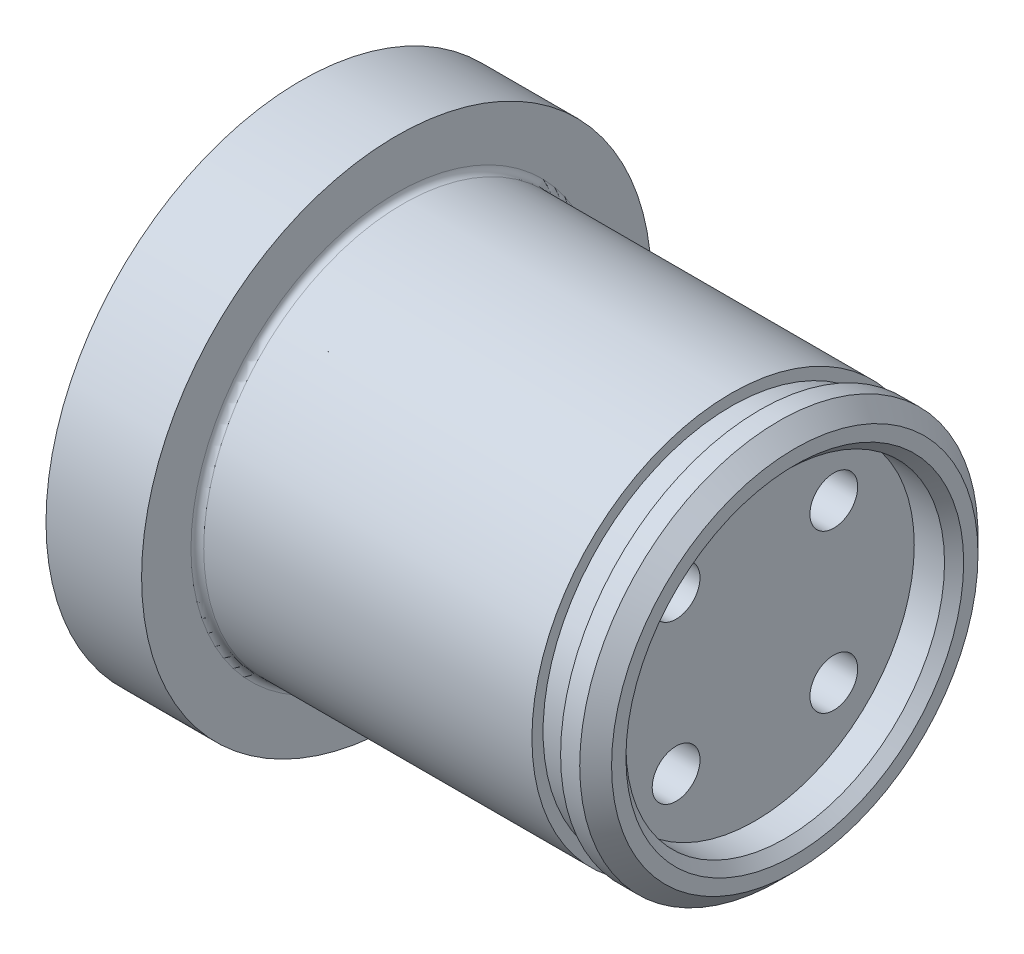
ISO-10303-21;
HEADER;
FILE_DESCRIPTION(('STEP AP214'),'2;1');
FILE_NAME('part.step','',(''),(''),'','','');
FILE_SCHEMA(('AUTOMOTIVE_DESIGN { 1 0 10303 214 1 1 1 1 }'));
ENDSEC;
DATA;
#1=APPLICATION_CONTEXT('core data for automotive mechanical design processes');
#2=APPLICATION_PROTOCOL_DEFINITION('international standard','automotive_design',2000,#1);
#3=PRODUCT_CONTEXT('',#1,'mechanical');
#4=PRODUCT('Part','Part','',(#3));
#5=PRODUCT_RELATED_PRODUCT_CATEGORY('part','',(#4));
#6=PRODUCT_DEFINITION_FORMATION('','',#4);
#7=PRODUCT_DEFINITION_CONTEXT('part definition',#1,'design');
#8=PRODUCT_DEFINITION('design','',#6,#7);
#9=PRODUCT_DEFINITION_SHAPE('','',#8);
#10=(LENGTH_UNIT() NAMED_UNIT(*) SI_UNIT(.MILLI.,.METRE.));
#11=(NAMED_UNIT(*) PLANE_ANGLE_UNIT() SI_UNIT($,.RADIAN.));
#12=(NAMED_UNIT(*) SI_UNIT($,.STERADIAN.) SOLID_ANGLE_UNIT());
#13=UNCERTAINTY_MEASURE_WITH_UNIT(LENGTH_MEASURE(1.E-05),#10,'distance_accuracy_value','');
#14=(GEOMETRIC_REPRESENTATION_CONTEXT(3) GLOBAL_UNCERTAINTY_ASSIGNED_CONTEXT((#13)) GLOBAL_UNIT_ASSIGNED_CONTEXT((#10,
#11,#12)) REPRESENTATION_CONTEXT('',''));
#15=CARTESIAN_POINT('',(0.,0.,0.));
#16=DIRECTION('',(0.,0.,1.));
#17=DIRECTION('',(1.,0.,0.));
#18=AXIS2_PLACEMENT_3D('',#15,#16,#17);
#19=CARTESIAN_POINT('',(0.,0.,0.));
#20=DIRECTION('',(-1.,0.,0.));
#21=DIRECTION('',(0.,0.,1.));
#22=AXIS2_PLACEMENT_3D('',#19,#20,#21);
#23=CYLINDRICAL_SURFACE('',#22,12.5);
#24=CARTESIAN_POINT('',(-24.6,0.,0.));
#25=DIRECTION('',(-1.,0.,0.));
#26=DIRECTION('',(0.,0.,1.));
#27=AXIS2_PLACEMENT_3D('',#24,#25,#26);
#28=CIRCLE('',#27,12.5);
#29=CARTESIAN_POINT('',(-24.6,0.,12.5));
#30=VERTEX_POINT('',#29);
#31=EDGE_CURVE('E43',#30,#30,#28,.F.);
#32=ORIENTED_EDGE('',*,*,#31,.T.);
#33=EDGE_LOOP('',(#32));
#34=FACE_BOUND('',#33,.T.);
#35=CARTESIAN_POINT('',(-4.00000000000001,0.,0.));
#36=DIRECTION('',(1.,0.,0.));
#37=DIRECTION('',(0.,0.,-1.));
#38=AXIS2_PLACEMENT_3D('',#35,#36,#37);
#39=CIRCLE('',#38,12.5);
#40=CARTESIAN_POINT('',(-4.00000000000001,0.,-12.5));
#41=VERTEX_POINT('',#40);
#42=EDGE_CURVE('E69',#41,#41,#39,.T.);
#43=ORIENTED_EDGE('',*,*,#42,.F.);
#44=EDGE_LOOP('',(#43));
#45=FACE_BOUND('',#44,.T.);
#46=ADVANCED_FACE('F32',(#34,#45),#23,.T.);
#47=CARTESIAN_POINT('',(-25.,12.5,0.));
#48=DIRECTION('',(-1.,0.,0.));
#49=DIRECTION('',(0.,0.,1.));
#50=AXIS2_PLACEMENT_3D('',#47,#48,#49);
#51=PLANE('',#50);
#52=CARTESIAN_POINT('',(-25.,0.,0.));
#53=DIRECTION('',(-1.,0.,0.));
#54=DIRECTION('',(0.,0.,1.));
#55=AXIS2_PLACEMENT_3D('',#52,#53,#54);
#56=CIRCLE('',#55,12.9);
#57=CARTESIAN_POINT('',(-25.,0.,12.9));
#58=VERTEX_POINT('',#57);
#59=EDGE_CURVE('E47',#58,#58,#56,.T.);
#60=ORIENTED_EDGE('',*,*,#59,.T.);
#61=EDGE_LOOP('',(#60));
#62=FACE_BOUND('',#61,.T.);
#63=CARTESIAN_POINT('',(-25.,0.,0.));
#64=DIRECTION('',(-1.,0.,0.));
#65=DIRECTION('',(0.,0.,1.));
#66=AXIS2_PLACEMENT_3D('',#63,#64,#65);
#67=CIRCLE('',#66,16.);
#68=CARTESIAN_POINT('',(-25.,0.,16.));
#69=VERTEX_POINT('',#68);
#70=EDGE_CURVE('E63',#69,#69,#67,.T.);
#71=ORIENTED_EDGE('',*,*,#70,.F.);
#72=EDGE_LOOP('',(#71));
#73=FACE_BOUND('',#72,.T.);
#74=ADVANCED_FACE('F120',(#62,#73),#51,.F.);
#75=CARTESIAN_POINT('',(0.,0.,0.));
#76=DIRECTION('',(-1.,0.,0.));
#77=DIRECTION('',(0.,0.,1.));
#78=AXIS2_PLACEMENT_3D('',#75,#76,#77);
#79=CYLINDRICAL_SURFACE('',#78,16.);
#80=CARTESIAN_POINT('',(-31.,0.,0.));
#81=DIRECTION('',(-1.,0.,0.));
#82=DIRECTION('',(0.,0.,1.));
#83=AXIS2_PLACEMENT_3D('',#80,#81,#82);
#84=CIRCLE('',#83,16.);
#85=CARTESIAN_POINT('',(-31.,0.,16.));
#86=VERTEX_POINT('',#85);
#87=EDGE_CURVE('E66',#86,#86,#84,.T.);
#88=ORIENTED_EDGE('',*,*,#87,.F.);
#89=EDGE_LOOP('',(#88));
#90=FACE_BOUND('',#89,.T.);
#91=ORIENTED_EDGE('',*,*,#70,.T.);
#92=EDGE_LOOP('',(#91));
#93=FACE_BOUND('',#92,.T.);
#94=ADVANCED_FACE('F127',(#90,#93),#79,.T.);
#95=CARTESIAN_POINT('',(-31.,16.,0.));
#96=DIRECTION('',(1.,0.,0.));
#97=DIRECTION('',(0.,0.,-1.));
#98=AXIS2_PLACEMENT_3D('',#95,#96,#97);
#99=PLANE('',#98);
#100=CARTESIAN_POINT('',(-31.,4.94974746830588,4.94974746830578));
#101=DIRECTION('',(1.,0.,0.));
#102=DIRECTION('',(0.,0.,-1.));
#103=AXIS2_PLACEMENT_3D('',#100,#101,#102);
#104=CIRCLE('',#103,1.50000000000001);
#105=CARTESIAN_POINT('',(-31.,4.94974746830588,3.44974746830577));
#106=VERTEX_POINT('',#105);
#107=EDGE_CURVE('E90',#106,#106,#104,.T.);
#108=ORIENTED_EDGE('',*,*,#107,.T.);
#109=EDGE_LOOP('',(#108));
#110=FACE_BOUND('',#109,.T.);
#111=CARTESIAN_POINT('',(-31.,-4.94974746830583,4.94974746830583));
#112=DIRECTION('',(1.,0.,0.));
#113=DIRECTION('',(0.,0.,-1.));
#114=AXIS2_PLACEMENT_3D('',#111,#112,#113);
#115=CIRCLE('',#114,1.50000000000001);
#116=CARTESIAN_POINT('',(-31.,-4.94974746830583,3.44974746830582));
#117=VERTEX_POINT('',#116);
#118=EDGE_CURVE('E87',#117,#117,#115,.T.);
#119=ORIENTED_EDGE('',*,*,#118,.T.);
#120=EDGE_LOOP('',(#119));
#121=FACE_BOUND('',#120,.T.);
#122=CARTESIAN_POINT('',(-31.,-4.94974746830585,-4.94974746830581));
#123=DIRECTION('',(1.,0.,0.));
#124=DIRECTION('',(0.,0.,-1.));
#125=AXIS2_PLACEMENT_3D('',#122,#123,#124);
#126=CIRCLE('',#125,1.50000000000001);
#127=CARTESIAN_POINT('',(-31.,-4.94974746830585,-6.44974746830583));
#128=VERTEX_POINT('',#127);
#129=EDGE_CURVE('E84',#128,#128,#126,.T.);
#130=ORIENTED_EDGE('',*,*,#129,.T.);
#131=EDGE_LOOP('',(#130));
#132=FACE_BOUND('',#131,.T.);
#133=CARTESIAN_POINT('',(-31.,4.94974746830583,-4.94974746830583));
#134=DIRECTION('',(1.,0.,0.));
#135=DIRECTION('',(0.,0.,-1.));
#136=AXIS2_PLACEMENT_3D('',#133,#134,#135);
#137=CIRCLE('',#136,1.50000000000001);
#138=CARTESIAN_POINT('',(-31.,4.94974746830583,-6.44974746830584));
#139=VERTEX_POINT('',#138);
#140=EDGE_CURVE('E81',#139,#139,#137,.T.);
#141=ORIENTED_EDGE('',*,*,#140,.T.);
#142=EDGE_LOOP('',(#141));
#143=FACE_BOUND('',#142,.T.);
#144=ORIENTED_EDGE('',*,*,#87,.T.);
#145=EDGE_LOOP('',(#144));
#146=FACE_BOUND('',#145,.T.);
#147=ADVANCED_FACE('F162',(#110,#121,#132,#143,#146),#99,.F.);
#148=CARTESIAN_POINT('',(-4.,12.5,0.));
#149=DIRECTION('',(-1.,0.,0.));
#150=DIRECTION('',(0.,0.,1.));
#151=AXIS2_PLACEMENT_3D('',#148,#149,#150);
#152=PLANE('',#151);
#153=CARTESIAN_POINT('',(-4.,0.,0.));
#154=DIRECTION('',(1.,0.,0.));
#155=DIRECTION('',(0.,0.,-1.));
#156=AXIS2_PLACEMENT_3D('',#153,#154,#155);
#157=CIRCLE('',#156,11.8);
#158=CARTESIAN_POINT('',(-4.,0.,-11.8));
#159=VERTEX_POINT('',#158);
#160=EDGE_CURVE('E72',#159,#159,#157,.T.);
#161=ORIENTED_EDGE('',*,*,#160,.F.);
#162=EDGE_LOOP('',(#161));
#163=FACE_BOUND('',#162,.T.);
#164=ORIENTED_EDGE('',*,*,#42,.T.);
#165=EDGE_LOOP('',(#164));
#166=FACE_BOUND('',#165,.T.);
#167=ADVANCED_FACE('F156',(#163,#166),#152,.F.);
#168=CARTESIAN_POINT('',(0.,0.,0.));
#169=DIRECTION('',(1.,0.,0.));
#170=DIRECTION('',(0.,0.,-1.));
#171=AXIS2_PLACEMENT_3D('',#168,#169,#170);
#172=CYLINDRICAL_SURFACE('',#171,11.8);
#173=CARTESIAN_POINT('',(-2.2,0.,0.));
#174=DIRECTION('',(1.,0.,0.));
#175=DIRECTION('',(0.,0.,-1.));
#176=AXIS2_PLACEMENT_3D('',#173,#174,#175);
#177=CIRCLE('',#176,11.8);
#178=CARTESIAN_POINT('',(-2.2,0.,-11.8));
#179=VERTEX_POINT('',#178);
#180=EDGE_CURVE('E75',#179,#179,#177,.T.);
#181=ORIENTED_EDGE('',*,*,#180,.F.);
#182=EDGE_LOOP('',(#181));
#183=FACE_BOUND('',#182,.T.);
#184=ORIENTED_EDGE('',*,*,#160,.T.);
#185=EDGE_LOOP('',(#184));
#186=FACE_BOUND('',#185,.T.);
#187=ADVANCED_FACE('F150',(#183,#186),#172,.T.);
#188=CARTESIAN_POINT('',(-2.2,11.8,0.));
#189=DIRECTION('',(1.,0.,0.));
#190=DIRECTION('',(0.,0.,-1.));
#191=AXIS2_PLACEMENT_3D('',#188,#189,#190);
#192=PLANE('',#191);
#193=CARTESIAN_POINT('',(-2.20000000000001,0.,0.));
#194=DIRECTION('',(1.,0.,0.));
#195=DIRECTION('',(0.,0.,-1.));
#196=AXIS2_PLACEMENT_3D('',#193,#194,#195);
#197=CIRCLE('',#196,12.5);
#198=CARTESIAN_POINT('',(-2.20000000000001,0.,-12.5));
#199=VERTEX_POINT('',#198);
#200=EDGE_CURVE('E78',#199,#199,#197,.T.);
#201=ORIENTED_EDGE('',*,*,#200,.F.);
#202=EDGE_LOOP('',(#201));
#203=FACE_BOUND('',#202,.T.);
#204=ORIENTED_EDGE('',*,*,#180,.T.);
#205=EDGE_LOOP('',(#204));
#206=FACE_BOUND('',#205,.T.);
#207=ADVANCED_FACE('F143',(#203,#206),#192,.F.);
#208=CARTESIAN_POINT('',(0.,0.,0.));
#209=DIRECTION('',(-1.,0.,0.));
#210=DIRECTION('',(0.,0.,1.));
#211=AXIS2_PLACEMENT_3D('',#208,#209,#210);
#212=PLANE('',#211);
#213=CARTESIAN_POINT('',(0.,0.,0.));
#214=DIRECTION('',(-1.,0.,0.));
#215=DIRECTION('',(0.,0.,1.));
#216=AXIS2_PLACEMENT_3D('',#213,#214,#215);
#217=CIRCLE('',#216,10.6);
#218=CARTESIAN_POINT('',(0.,0.,10.6));
#219=VERTEX_POINT('',#218);
#220=EDGE_CURVE('E10',#219,#219,#217,.T.);
#221=ORIENTED_EDGE('',*,*,#220,.T.);
#222=EDGE_LOOP('',(#221));
#223=FACE_BOUND('',#222,.T.);
#224=CARTESIAN_POINT('',(0.,0.,0.));
#225=DIRECTION('',(-1.,0.,0.));
#226=DIRECTION('',(0.,0.,1.));
#227=AXIS2_PLACEMENT_3D('',#224,#225,#226);
#228=CIRCLE('',#227,11.5);
#229=CARTESIAN_POINT('',(0.,0.,11.5));
#230=VERTEX_POINT('',#229);
#231=EDGE_CURVE('E57',#230,#230,#228,.F.);
#232=ORIENTED_EDGE('',*,*,#231,.T.);
#233=EDGE_LOOP('',(#232));
#234=FACE_BOUND('',#233,.T.);
#235=ADVANCED_FACE('F134',(#223,#234),#212,.F.);
#236=CARTESIAN_POINT('',(-0.999999999999996,0.,0.));
#237=DIRECTION('',(-1.,0.,0.));
#238=DIRECTION('',(0.,0.,1.));
#239=AXIS2_PLACEMENT_3D('',#236,#237,#238);
#240=CIRCLE('',#239,12.5);
#241=CARTESIAN_POINT('',(-0.999999999999996,0.,12.5));
#242=VERTEX_POINT('',#241);
#243=EDGE_CURVE('E60',#242,#242,#240,.T.);
#244=ORIENTED_EDGE('',*,*,#243,.T.);
#245=EDGE_LOOP('',(#244));
#246=FACE_BOUND('',#245,.T.);
#247=ORIENTED_EDGE('',*,*,#200,.T.);
#248=EDGE_LOOP('',(#247));
#249=FACE_BOUND('',#248,.T.);
#250=ADVANCED_FACE('F123',(#246,#249),#23,.T.);
#251=CARTESIAN_POINT('',(-0.999999999999996,0.,0.));
#252=DIRECTION('',(-1.,0.,0.));
#253=DIRECTION('',(0.,0.,1.));
#254=AXIS2_PLACEMENT_3D('',#251,#252,#253);
#255=CONICAL_SURFACE('',#254,12.5,0.785398163397451);
#256=ORIENTED_EDGE('',*,*,#231,.F.);
#257=EDGE_LOOP('',(#256));
#258=FACE_BOUND('',#257,.T.);
#259=ORIENTED_EDGE('',*,*,#243,.F.);
#260=EDGE_LOOP('',(#259));
#261=FACE_BOUND('',#260,.T.);
#262=ADVANCED_FACE('F133',(#258,#261),#255,.T.);
#263=CARTESIAN_POINT('',(-24.6,0.,0.));
#264=DIRECTION('',(-1.,0.,0.));
#265=DIRECTION('',(0.,0.,1.));
#266=AXIS2_PLACEMENT_3D('',#263,#264,#265);
#267=TOROIDAL_SURFACE('',#266,12.9,0.4);
#268=ORIENTED_EDGE('',*,*,#31,.F.);
#269=EDGE_LOOP('',(#268));
#270=FACE_BOUND('',#269,.T.);
#271=ORIENTED_EDGE('',*,*,#59,.F.);
#272=EDGE_LOOP('',(#271));
#273=FACE_BOUND('',#272,.T.);
#274=ADVANCED_FACE('F140',(#270,#273),#267,.F.);
#275=CARTESIAN_POINT('',(0.,4.94974746830583,-4.94974746830583));
#276=DIRECTION('',(1.,0.,0.));
#277=DIRECTION('',(0.,0.,-1.));
#278=AXIS2_PLACEMENT_3D('',#275,#276,#277);
#279=CYLINDRICAL_SURFACE('',#278,1.50000000000001);
#280=CARTESIAN_POINT('',(-2.5,4.94974746830583,-4.94974746830583));
#281=DIRECTION('',(-1.,0.,0.));
#282=DIRECTION('',(0.,0.,1.));
#283=AXIS2_PLACEMENT_3D('',#280,#281,#282);
#284=CIRCLE('',#283,1.50000000000001);
#285=CARTESIAN_POINT('',(-2.5,4.94974746830583,-3.44974746830582));
#286=VERTEX_POINT('',#285);
#287=EDGE_CURVE('E93',#286,#286,#284,.F.);
#288=ORIENTED_EDGE('',*,*,#287,.T.);
#289=EDGE_LOOP('',(#288));
#290=FACE_BOUND('',#289,.T.);
#291=ORIENTED_EDGE('',*,*,#140,.F.);
#292=EDGE_LOOP('',(#291));
#293=FACE_BOUND('',#292,.T.);
#294=ADVANCED_FACE('F196',(#290,#293),#279,.F.);
#295=CARTESIAN_POINT('',(0.,-4.94974746830585,-4.94974746830581));
#296=DIRECTION('',(1.,0.,0.));
#297=DIRECTION('',(0.,0.,-1.));
#298=AXIS2_PLACEMENT_3D('',#295,#296,#297);
#299=CYLINDRICAL_SURFACE('',#298,1.50000000000001);
#300=CARTESIAN_POINT('',(-2.5,-4.94974746830585,-4.94974746830581));
#301=DIRECTION('',(-1.,0.,0.));
#302=DIRECTION('',(0.,0.,1.));
#303=AXIS2_PLACEMENT_3D('',#300,#301,#302);
#304=CIRCLE('',#303,1.50000000000001);
#305=CARTESIAN_POINT('',(-2.5,-4.94974746830585,-3.4497474683058));
#306=VERTEX_POINT('',#305);
#307=EDGE_CURVE('E96',#306,#306,#304,.F.);
#308=ORIENTED_EDGE('',*,*,#307,.T.);
#309=EDGE_LOOP('',(#308));
#310=FACE_BOUND('',#309,.T.);
#311=ORIENTED_EDGE('',*,*,#129,.F.);
#312=EDGE_LOOP('',(#311));
#313=FACE_BOUND('',#312,.T.);
#314=ADVANCED_FACE('F201',(#310,#313),#299,.F.);
#315=CARTESIAN_POINT('',(0.,-4.94974746830583,4.94974746830583));
#316=DIRECTION('',(1.,0.,0.));
#317=DIRECTION('',(0.,0.,-1.));
#318=AXIS2_PLACEMENT_3D('',#315,#316,#317);
#319=CYLINDRICAL_SURFACE('',#318,1.50000000000001);
#320=CARTESIAN_POINT('',(-2.5,-4.94974746830583,4.94974746830583));
#321=DIRECTION('',(-1.,0.,0.));
#322=DIRECTION('',(0.,0.,1.));
#323=AXIS2_PLACEMENT_3D('',#320,#321,#322);
#324=CIRCLE('',#323,1.50000000000001);
#325=CARTESIAN_POINT('',(-2.5,-4.94974746830583,6.44974746830584));
#326=VERTEX_POINT('',#325);
#327=EDGE_CURVE('E52',#326,#326,#324,.F.);
#328=ORIENTED_EDGE('',*,*,#327,.T.);
#329=EDGE_LOOP('',(#328));
#330=FACE_BOUND('',#329,.T.);
#331=ORIENTED_EDGE('',*,*,#118,.F.);
#332=EDGE_LOOP('',(#331));
#333=FACE_BOUND('',#332,.T.);
#334=ADVANCED_FACE('F211',(#330,#333),#319,.F.);
#335=CARTESIAN_POINT('',(0.,4.94974746830588,4.94974746830578));
#336=DIRECTION('',(1.,0.,0.));
#337=DIRECTION('',(0.,0.,-1.));
#338=AXIS2_PLACEMENT_3D('',#335,#336,#337);
#339=CYLINDRICAL_SURFACE('',#338,1.50000000000001);
#340=CARTESIAN_POINT('',(-2.5,4.94974746830588,4.94974746830578));
#341=DIRECTION('',(-1.,0.,0.));
#342=DIRECTION('',(0.,0.,1.));
#343=AXIS2_PLACEMENT_3D('',#340,#341,#342);
#344=CIRCLE('',#343,1.50000000000001);
#345=CARTESIAN_POINT('',(-2.5,4.94974746830588,6.44974746830579));
#346=VERTEX_POINT('',#345);
#347=EDGE_CURVE('E50',#346,#346,#344,.F.);
#348=ORIENTED_EDGE('',*,*,#347,.T.);
#349=EDGE_LOOP('',(#348));
#350=FACE_BOUND('',#349,.T.);
#351=ORIENTED_EDGE('',*,*,#107,.F.);
#352=EDGE_LOOP('',(#351));
#353=FACE_BOUND('',#352,.T.);
#354=ADVANCED_FACE('F115',(#350,#353),#339,.F.);
#355=CARTESIAN_POINT('',(-2.5,10.,0.));
#356=DIRECTION('',(-1.,0.,0.));
#357=DIRECTION('',(0.,0.,1.));
#358=AXIS2_PLACEMENT_3D('',#355,#356,#357);
#359=PLANE('',#358);
#360=ORIENTED_EDGE('',*,*,#307,.F.);
#361=EDGE_LOOP('',(#360));
#362=FACE_BOUND('',#361,.T.);
#363=ORIENTED_EDGE('',*,*,#347,.F.);
#364=EDGE_LOOP('',(#363));
#365=FACE_BOUND('',#364,.T.);
#366=CARTESIAN_POINT('',(-2.5,0.,0.));
#367=DIRECTION('',(1.,0.,0.));
#368=DIRECTION('',(0.,0.,-1.));
#369=AXIS2_PLACEMENT_3D('',#366,#367,#368);
#370=CIRCLE('',#369,10.);
#371=CARTESIAN_POINT('',(-2.5,0.,-10.));
#372=VERTEX_POINT('',#371);
#373=EDGE_CURVE('E53',#372,#372,#370,.T.);
#374=ORIENTED_EDGE('',*,*,#373,.T.);
#375=EDGE_LOOP('',(#374));
#376=FACE_BOUND('',#375,.T.);
#377=ORIENTED_EDGE('',*,*,#327,.F.);
#378=EDGE_LOOP('',(#377));
#379=FACE_BOUND('',#378,.T.);
#380=ORIENTED_EDGE('',*,*,#287,.F.);
#381=EDGE_LOOP('',(#380));
#382=FACE_BOUND('',#381,.T.);
#383=ADVANCED_FACE('F104',(#362,#365,#376,#379,#382),#359,.F.);
#384=CARTESIAN_POINT('',(0.,0.,0.));
#385=DIRECTION('',(1.,0.,0.));
#386=DIRECTION('',(0.,0.,-1.));
#387=AXIS2_PLACEMENT_3D('',#384,#385,#386);
#388=CYLINDRICAL_SURFACE('',#387,10.);
#389=CARTESIAN_POINT('',(-0.599999999999998,0.,0.));
#390=DIRECTION('',(-1.,0.,0.));
#391=DIRECTION('',(0.,0.,1.));
#392=AXIS2_PLACEMENT_3D('',#389,#390,#391);
#393=CIRCLE('',#392,10.);
#394=CARTESIAN_POINT('',(-0.599999999999998,0.,10.));
#395=VERTEX_POINT('',#394);
#396=EDGE_CURVE('E39',#395,#395,#393,.F.);
#397=ORIENTED_EDGE('',*,*,#396,.T.);
#398=EDGE_LOOP('',(#397));
#399=FACE_BOUND('',#398,.T.);
#400=ORIENTED_EDGE('',*,*,#373,.F.);
#401=EDGE_LOOP('',(#400));
#402=FACE_BOUND('',#401,.T.);
#403=ADVANCED_FACE('F107',(#399,#402),#388,.F.);
#404=CARTESIAN_POINT('',(-0.599999999999998,0.,0.));
#405=DIRECTION('',(1.,0.,0.));
#406=DIRECTION('',(0.,0.,-1.));
#407=AXIS2_PLACEMENT_3D('',#404,#405,#406);
#408=CONICAL_SURFACE('',#407,10.,0.785398163397448);
#409=ORIENTED_EDGE('',*,*,#220,.F.);
#410=EDGE_LOOP('',(#409));
#411=FACE_BOUND('',#410,.T.);
#412=ORIENTED_EDGE('',*,*,#396,.F.);
#413=EDGE_LOOP('',(#412));
#414=FACE_BOUND('',#413,.T.);
#415=ADVANCED_FACE('F34',(#411,#414),#408,.F.);
#416=CLOSED_SHELL('',(#46,#74,#94,#147,#167,#187,#207,#235,#250,#262,#274,#294,#314,#334,#354,
#383,#403,#415));
#417=MANIFOLD_SOLID_BREP('B2',#416);
#418=ADVANCED_BREP_SHAPE_REPRESENTATION('',(#18,#417),#14);
#419=SHAPE_DEFINITION_REPRESENTATION(#9,#418);
ENDSEC;
END-ISO-10303-21;
